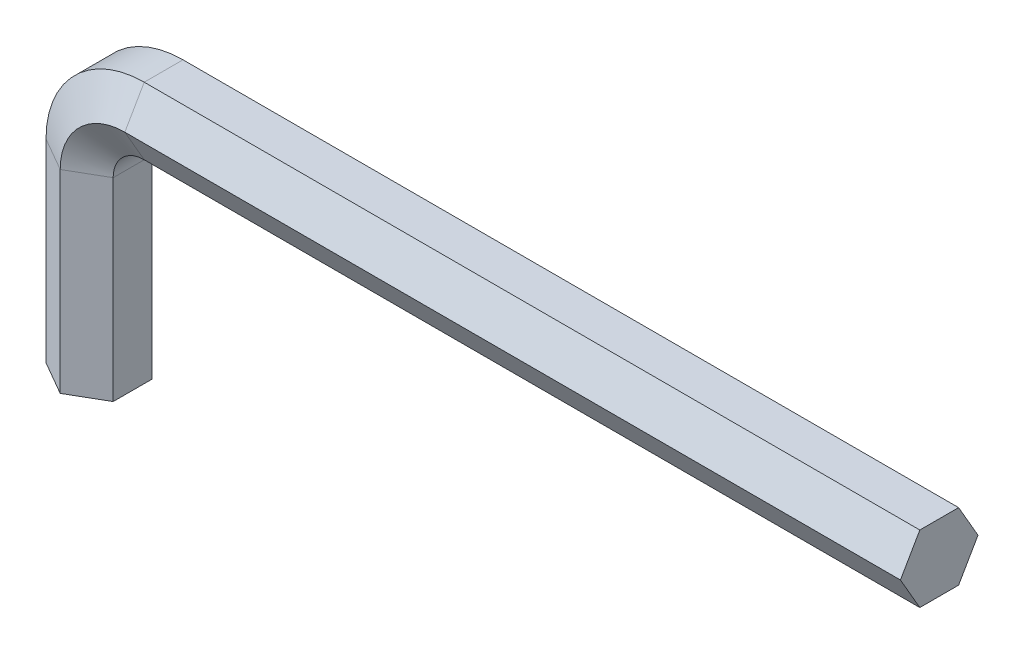
ISO-10303-21;
HEADER;
FILE_DESCRIPTION(('STEP AP214'),'2;1');
FILE_NAME('part.step','',(''),(''),'','','');
FILE_SCHEMA(('AUTOMOTIVE_DESIGN { 1 0 10303 214 1 1 1 1 }'));
ENDSEC;
DATA;
#1=APPLICATION_CONTEXT('core data for automotive mechanical design processes');
#2=APPLICATION_PROTOCOL_DEFINITION('international standard','automotive_design',2000,#1);
#3=PRODUCT_CONTEXT('',#1,'mechanical');
#4=PRODUCT('Part','Part','',(#3));
#5=PRODUCT_RELATED_PRODUCT_CATEGORY('part','',(#4));
#6=PRODUCT_DEFINITION_FORMATION('','',#4);
#7=PRODUCT_DEFINITION_CONTEXT('part definition',#1,'design');
#8=PRODUCT_DEFINITION('design','',#6,#7);
#9=PRODUCT_DEFINITION_SHAPE('','',#8);
#10=(LENGTH_UNIT() NAMED_UNIT(*) SI_UNIT(.MILLI.,.METRE.));
#11=(NAMED_UNIT(*) PLANE_ANGLE_UNIT() SI_UNIT($,.RADIAN.));
#12=(NAMED_UNIT(*) SI_UNIT($,.STERADIAN.) SOLID_ANGLE_UNIT());
#13=UNCERTAINTY_MEASURE_WITH_UNIT(LENGTH_MEASURE(1.E-05),#10,'distance_accuracy_value','');
#14=(GEOMETRIC_REPRESENTATION_CONTEXT(3) GLOBAL_UNCERTAINTY_ASSIGNED_CONTEXT((#13)) GLOBAL_UNIT_ASSIGNED_CONTEXT((#10,
#11,#12)) REPRESENTATION_CONTEXT('',''));
#15=CARTESIAN_POINT('',(0.,0.,0.));
#16=DIRECTION('',(0.,0.,1.));
#17=DIRECTION('',(1.,0.,0.));
#18=AXIS2_PLACEMENT_3D('',#15,#16,#17);
#19=CARTESIAN_POINT('',(62.3715948169983,0.,0.));
#20=DIRECTION('',(-1.,0.,0.));
#21=DIRECTION('',(0.,0.,1.));
#22=AXIS2_PLACEMENT_3D('',#19,#20,#21);
#23=PLANE('',#22);
#24=DIRECTION('',(0.,0.866025403784439,0.5));
#25=VECTOR('',#24,1.);
#26=CARTESIAN_POINT('',(62.3715948169983,-5.68289713359378,15.));
#27=LINE('',#26,#25);
#28=CARTESIAN_POINT('',(62.3715948169983,-5.68289713359378,15.));
#29=VERTEX_POINT('',#28);
#30=CARTESIAN_POINT('',(62.3715948169983,20.2978649799394,30.));
#31=VERTEX_POINT('',#30);
#32=EDGE_CURVE('E182',#29,#31,#27,.T.);
#33=ORIENTED_EDGE('',*,*,#32,.F.);
#34=DIRECTION('',(0.,0.,1.));
#35=VECTOR('',#34,1.);
#36=CARTESIAN_POINT('',(62.3715948169983,-5.68289713359378,-15.));
#37=LINE('',#36,#35);
#38=CARTESIAN_POINT('',(62.3715948169983,-5.68289713359378,-15.));
#39=VERTEX_POINT('',#38);
#40=EDGE_CURVE('E224',#39,#29,#37,.T.);
#41=ORIENTED_EDGE('',*,*,#40,.F.);
#42=DIRECTION('',(0.,-0.866025403784439,0.5));
#43=VECTOR('',#42,1.);
#44=CARTESIAN_POINT('',(62.3715948169983,20.2978649799394,-30.));
#45=LINE('',#44,#43);
#46=CARTESIAN_POINT('',(62.3715948169983,20.2978649799394,-30.));
#47=VERTEX_POINT('',#46);
#48=EDGE_CURVE('E211',#47,#39,#45,.T.);
#49=ORIENTED_EDGE('',*,*,#48,.F.);
#50=DIRECTION('',(0.,-0.866025403784439,-0.5));
#51=VECTOR('',#50,1.);
#52=CARTESIAN_POINT('',(62.3715948169983,46.2786270934726,-15.));
#53=LINE('',#52,#51);
#54=CARTESIAN_POINT('',(62.3715948169983,46.2786270934726,-15.));
#55=VERTEX_POINT('',#54);
#56=EDGE_CURVE('E134',#55,#47,#53,.T.);
#57=ORIENTED_EDGE('',*,*,#56,.F.);
#58=DIRECTION('',(0.,0.,-1.));
#59=VECTOR('',#58,1.);
#60=CARTESIAN_POINT('',(62.3715948169983,46.2786270934726,15.));
#61=LINE('',#60,#59);
#62=CARTESIAN_POINT('',(62.3715948169983,46.2786270934726,15.));
#63=VERTEX_POINT('',#62);
#64=EDGE_CURVE('E138',#63,#55,#61,.T.);
#65=ORIENTED_EDGE('',*,*,#64,.F.);
#66=DIRECTION('',(0.,0.866025403784439,-0.5));
#67=VECTOR('',#66,1.);
#68=CARTESIAN_POINT('',(62.3715948169983,20.2978649799394,30.));
#69=LINE('',#68,#67);
#70=EDGE_CURVE('E143',#31,#63,#69,.T.);
#71=ORIENTED_EDGE('',*,*,#70,.F.);
#72=EDGE_LOOP('',(#33,#41,#49,#57,#65,#71));
#73=FACE_BOUND('',#72,.T.);
#74=ADVANCED_FACE('F33',(#73),#23,.F.);
#75=CARTESIAN_POINT('',(-567.330540203062,-179.702135020061,0.));
#76=DIRECTION('',(0.,-1.,0.));
#77=DIRECTION('',(0.,0.,1.));
#78=AXIS2_PLACEMENT_3D('',#75,#76,#77);
#79=PLANE('',#78);
#80=DIRECTION('',(-0.866025403784439,0.,0.5));
#81=VECTOR('',#80,1.);
#82=CARTESIAN_POINT('',(-561.647643069469,-179.702135020061,15.));
#83=LINE('',#82,#81);
#84=CARTESIAN_POINT('',(-561.647643069469,-179.702135020061,15.));
#85=VERTEX_POINT('',#84);
#86=CARTESIAN_POINT('',(-587.628405183002,-179.702135020061,30.));
#87=VERTEX_POINT('',#86);
#88=EDGE_CURVE('E154',#85,#87,#83,.T.);
#89=ORIENTED_EDGE('',*,*,#88,.T.);
#90=DIRECTION('',(-0.866025403784439,0.,-0.5));
#91=VECTOR('',#90,1.);
#92=CARTESIAN_POINT('',(-587.628405183002,-179.702135020061,30.));
#93=LINE('',#92,#91);
#94=CARTESIAN_POINT('',(-613.609167296535,-179.702135020061,15.));
#95=VERTEX_POINT('',#94);
#96=EDGE_CURVE('E157',#87,#95,#93,.T.);
#97=ORIENTED_EDGE('',*,*,#96,.T.);
#98=DIRECTION('',(0.,0.,-1.));
#99=VECTOR('',#98,1.);
#100=CARTESIAN_POINT('',(-613.609167296535,-179.702135020061,15.));
#101=LINE('',#100,#99);
#102=CARTESIAN_POINT('',(-613.609167296535,-179.702135020061,-15.));
#103=VERTEX_POINT('',#102);
#104=EDGE_CURVE('E197',#95,#103,#101,.T.);
#105=ORIENTED_EDGE('',*,*,#104,.T.);
#106=DIRECTION('',(0.866025403784439,0.,-0.5));
#107=VECTOR('',#106,1.);
#108=CARTESIAN_POINT('',(-613.609167296535,-179.702135020061,-15.));
#109=LINE('',#108,#107);
#110=CARTESIAN_POINT('',(-587.628405183002,-179.702135020061,-30.));
#111=VERTEX_POINT('',#110);
#112=EDGE_CURVE('E52',#103,#111,#109,.T.);
#113=ORIENTED_EDGE('',*,*,#112,.T.);
#114=DIRECTION('',(0.866025403784439,0.,0.5));
#115=VECTOR('',#114,1.);
#116=CARTESIAN_POINT('',(-587.628405183002,-179.702135020061,-30.));
#117=LINE('',#116,#115);
#118=CARTESIAN_POINT('',(-561.647643069469,-179.702135020061,-15.));
#119=VERTEX_POINT('',#118);
#120=EDGE_CURVE('E46',#111,#119,#117,.T.);
#121=ORIENTED_EDGE('',*,*,#120,.T.);
#122=DIRECTION('',(0.,0.,1.));
#123=VECTOR('',#122,1.);
#124=CARTESIAN_POINT('',(-561.647643069469,-179.702135020061,-15.));
#125=LINE('',#124,#123);
#126=EDGE_CURVE('E11',#119,#85,#125,.T.);
#127=ORIENTED_EDGE('',*,*,#126,.T.);
#128=EDGE_LOOP('',(#89,#97,#105,#113,#121,#127));
#129=FACE_BOUND('',#128,.T.);
#130=ADVANCED_FACE('F156',(#129),#79,.T.);
#131=CARTESIAN_POINT('',(62.3715948169983,-5.68289713359378,15.));
#132=DIRECTION('',(0.,-0.5,0.866025403784439));
#133=DIRECTION('',(0.,-0.866025403784439,-0.5));
#134=AXIS2_PLACEMENT_3D('',#131,#132,#133);
#135=PLANE('',#134);
#136=DIRECTION('',(-1.,0.,0.));
#137=VECTOR('',#136,1.);
#138=CARTESIAN_POINT('',(62.3715948169983,20.2978649799394,30.));
#139=LINE('',#138,#137);
#140=CARTESIAN_POINT('',(-537.628405183002,20.2978649799394,30.));
#141=VERTEX_POINT('',#140);
#142=EDGE_CURVE('E187',#31,#141,#139,.T.);
#143=ORIENTED_EDGE('',*,*,#142,.T.);
#144=DIRECTION('',(0.,0.866025403784439,0.5));
#145=VECTOR('',#144,1.);
#146=CARTESIAN_POINT('',(-537.628405183002,-5.68289713359378,15.));
#147=LINE('',#146,#145);
#148=CARTESIAN_POINT('',(-537.628405183002,-5.68289713359378,15.));
#149=VERTEX_POINT('',#148);
#150=EDGE_CURVE('E256',#149,#141,#147,.T.);
#151=ORIENTED_EDGE('',*,*,#150,.F.);
#152=DIRECTION('',(-1.,0.,0.));
#153=VECTOR('',#152,1.);
#154=CARTESIAN_POINT('',(62.3715948169983,-5.68289713359378,15.));
#155=LINE('',#154,#153);
#156=EDGE_CURVE('E238',#29,#149,#155,.T.);
#157=ORIENTED_EDGE('',*,*,#156,.F.);
#158=ORIENTED_EDGE('',*,*,#32,.T.);
#159=EDGE_LOOP('',(#143,#151,#157,#158));
#160=FACE_BOUND('',#159,.T.);
#161=ADVANCED_FACE('F263',(#160),#135,.T.);
#162=CARTESIAN_POINT('',(62.3715948169983,20.2978649799394,30.));
#163=DIRECTION('',(0.,0.5,0.866025403784439));
#164=DIRECTION('',(0.,-0.866025403784439,0.5));
#165=AXIS2_PLACEMENT_3D('',#162,#163,#164);
#166=PLANE('',#165);
#167=DIRECTION('',(-1.,0.,0.));
#168=VECTOR('',#167,1.);
#169=CARTESIAN_POINT('',(62.3715948169983,46.2786270934726,15.));
#170=LINE('',#169,#168);
#171=CARTESIAN_POINT('',(-537.628405183002,46.2786270934726,15.));
#172=VERTEX_POINT('',#171);
#173=EDGE_CURVE('E186',#63,#172,#170,.T.);
#174=ORIENTED_EDGE('',*,*,#173,.T.);
#175=DIRECTION('',(0.,0.866025403784439,-0.5));
#176=VECTOR('',#175,1.);
#177=CARTESIAN_POINT('',(-537.628405183002,20.2978649799394,30.));
#178=LINE('',#177,#176);
#179=EDGE_CURVE('E183',#141,#172,#178,.T.);
#180=ORIENTED_EDGE('',*,*,#179,.F.);
#181=ORIENTED_EDGE('',*,*,#142,.F.);
#182=ORIENTED_EDGE('',*,*,#70,.T.);
#183=EDGE_LOOP('',(#174,#180,#181,#182));
#184=FACE_BOUND('',#183,.T.);
#185=ADVANCED_FACE('F266',(#184),#166,.T.);
#186=CARTESIAN_POINT('',(62.3715948169983,46.2786270934726,15.));
#187=DIRECTION('',(0.,1.,0.));
#188=DIRECTION('',(0.,0.,1.));
#189=AXIS2_PLACEMENT_3D('',#186,#187,#188);
#190=PLANE('',#189);
#191=DIRECTION('',(-1.,0.,0.));
#192=VECTOR('',#191,1.);
#193=CARTESIAN_POINT('',(62.3715948169983,46.2786270934726,-15.));
#194=LINE('',#193,#192);
#195=CARTESIAN_POINT('',(-537.628405183002,46.2786270934726,-15.));
#196=VERTEX_POINT('',#195);
#197=EDGE_CURVE('E200',#55,#196,#194,.T.);
#198=ORIENTED_EDGE('',*,*,#197,.T.);
#199=DIRECTION('',(0.,0.,-1.));
#200=VECTOR('',#199,1.);
#201=CARTESIAN_POINT('',(-537.628405183002,46.2786270934726,15.));
#202=LINE('',#201,#200);
#203=EDGE_CURVE('E190',#172,#196,#202,.T.);
#204=ORIENTED_EDGE('',*,*,#203,.F.);
#205=ORIENTED_EDGE('',*,*,#173,.F.);
#206=ORIENTED_EDGE('',*,*,#64,.T.);
#207=EDGE_LOOP('',(#198,#204,#205,#206));
#208=FACE_BOUND('',#207,.T.);
#209=ADVANCED_FACE('F320',(#208),#190,.T.);
#210=CARTESIAN_POINT('',(62.3715948169983,46.2786270934726,-15.));
#211=DIRECTION('',(0.,0.5,-0.866025403784439));
#212=DIRECTION('',(0.,0.866025403784439,0.5));
#213=AXIS2_PLACEMENT_3D('',#210,#211,#212);
#214=PLANE('',#213);
#215=DIRECTION('',(-1.,0.,0.));
#216=VECTOR('',#215,1.);
#217=CARTESIAN_POINT('',(62.3715948169983,20.2978649799394,-30.));
#218=LINE('',#217,#216);
#219=CARTESIAN_POINT('',(-537.628405183002,20.2978649799394,-30.));
#220=VERTEX_POINT('',#219);
#221=EDGE_CURVE('E213',#47,#220,#218,.T.);
#222=ORIENTED_EDGE('',*,*,#221,.T.);
#223=DIRECTION('',(0.,-0.866025403784439,-0.5));
#224=VECTOR('',#223,1.);
#225=CARTESIAN_POINT('',(-537.628405183002,46.2786270934726,-15.));
#226=LINE('',#225,#224);
#227=EDGE_CURVE('E203',#196,#220,#226,.T.);
#228=ORIENTED_EDGE('',*,*,#227,.F.);
#229=ORIENTED_EDGE('',*,*,#197,.F.);
#230=ORIENTED_EDGE('',*,*,#56,.T.);
#231=EDGE_LOOP('',(#222,#228,#229,#230));
#232=FACE_BOUND('',#231,.T.);
#233=ADVANCED_FACE('F328',(#232),#214,.T.);
#234=CARTESIAN_POINT('',(62.3715948169983,20.2978649799394,-30.));
#235=DIRECTION('',(0.,-0.5,-0.866025403784439));
#236=DIRECTION('',(0.,0.866025403784439,-0.5));
#237=AXIS2_PLACEMENT_3D('',#234,#235,#236);
#238=PLANE('',#237);
#239=DIRECTION('',(-1.,0.,0.));
#240=VECTOR('',#239,1.);
#241=CARTESIAN_POINT('',(62.3715948169983,-5.68289713359378,-15.));
#242=LINE('',#241,#240);
#243=CARTESIAN_POINT('',(-537.628405183002,-5.68289713359378,-15.));
#244=VERTEX_POINT('',#243);
#245=EDGE_CURVE('E226',#39,#244,#242,.T.);
#246=ORIENTED_EDGE('',*,*,#245,.T.);
#247=DIRECTION('',(0.,-0.866025403784439,0.5));
#248=VECTOR('',#247,1.);
#249=CARTESIAN_POINT('',(-537.628405183002,20.2978649799394,-30.));
#250=LINE('',#249,#248);
#251=EDGE_CURVE('E216',#220,#244,#250,.T.);
#252=ORIENTED_EDGE('',*,*,#251,.F.);
#253=ORIENTED_EDGE('',*,*,#221,.F.);
#254=ORIENTED_EDGE('',*,*,#48,.T.);
#255=EDGE_LOOP('',(#246,#252,#253,#254));
#256=FACE_BOUND('',#255,.T.);
#257=ADVANCED_FACE('F338',(#256),#238,.T.);
#258=CARTESIAN_POINT('',(62.3715948169983,-5.68289713359378,-15.));
#259=DIRECTION('',(0.,-1.,0.));
#260=DIRECTION('',(0.,0.,-1.));
#261=AXIS2_PLACEMENT_3D('',#258,#259,#260);
#262=PLANE('',#261);
#263=DIRECTION('',(0.,0.,1.));
#264=VECTOR('',#263,1.);
#265=CARTESIAN_POINT('',(-537.628405183002,-5.68289713359378,-15.));
#266=LINE('',#265,#264);
#267=EDGE_CURVE('E229',#244,#149,#266,.T.);
#268=ORIENTED_EDGE('',*,*,#267,.F.);
#269=ORIENTED_EDGE('',*,*,#245,.F.);
#270=ORIENTED_EDGE('',*,*,#40,.T.);
#271=ORIENTED_EDGE('',*,*,#156,.T.);
#272=EDGE_LOOP('',(#268,#269,#270,#271));
#273=FACE_BOUND('',#272,.T.);
#274=ADVANCED_FACE('F279',(#273),#262,.T.);
#275=CARTESIAN_POINT('',(-537.628405183002,-29.7021350200607,15.));
#276=DIRECTION('',(0.,0.,1.));
#277=DIRECTION('',(1.,0.,0.));
#278=AXIS2_PLACEMENT_3D('',#275,#276,#277);
#279=CONICAL_SURFACE('',#278,24.0192378864669,1.0471975511966);
#280=CARTESIAN_POINT('',(-537.628405183002,-29.7021350200607,30.));
#281=DIRECTION('',(0.,0.,1.));
#282=DIRECTION('',(0.,1.,0.));
#283=AXIS2_PLACEMENT_3D('',#280,#281,#282);
#284=CIRCLE('',#283,50.);
#285=CARTESIAN_POINT('',(-587.628405183002,-29.7021350200607,30.));
#286=VERTEX_POINT('',#285);
#287=EDGE_CURVE('E193',#141,#286,#284,.T.);
#288=ORIENTED_EDGE('',*,*,#287,.T.);
#289=DIRECTION('',(-0.866025403784439,0.,0.5));
#290=VECTOR('',#289,1.);
#291=CARTESIAN_POINT('',(-561.647643069469,-29.7021350200607,15.));
#292=LINE('',#291,#290);
#293=CARTESIAN_POINT('',(-561.647643069469,-29.7021350200607,15.));
#294=VERTEX_POINT('',#293);
#295=EDGE_CURVE('E175',#294,#286,#292,.T.);
#296=ORIENTED_EDGE('',*,*,#295,.F.);
#297=CARTESIAN_POINT('',(-537.628405183002,-29.7021350200607,15.));
#298=DIRECTION('',(0.,0.,1.));
#299=DIRECTION('',(0.,1.,0.));
#300=AXIS2_PLACEMENT_3D('',#297,#298,#299);
#301=CIRCLE('',#300,24.0192378864669);
#302=EDGE_CURVE('E240',#149,#294,#301,.T.);
#303=ORIENTED_EDGE('',*,*,#302,.F.);
#304=ORIENTED_EDGE('',*,*,#150,.T.);
#305=EDGE_LOOP('',(#288,#296,#303,#304));
#306=FACE_BOUND('',#305,.T.);
#307=ADVANCED_FACE('F246',(#306),#279,.F.);
#308=CARTESIAN_POINT('',(-537.628405183002,-29.7021350200607,30.));
#309=DIRECTION('',(0.,0.,-1.));
#310=DIRECTION('',(-1.,0.,0.));
#311=AXIS2_PLACEMENT_3D('',#308,#309,#310);
#312=CONICAL_SURFACE('',#311,50.,1.0471975511966);
#313=CARTESIAN_POINT('',(-537.628405183002,-29.7021350200607,15.));
#314=DIRECTION('',(0.,0.,1.));
#315=DIRECTION('',(0.,1.,0.));
#316=AXIS2_PLACEMENT_3D('',#313,#314,#315);
#317=CIRCLE('',#316,75.9807621135332);
#318=CARTESIAN_POINT('',(-613.609167296535,-29.7021350200607,15.));
#319=VERTEX_POINT('',#318);
#320=EDGE_CURVE('E121',#172,#319,#317,.T.);
#321=ORIENTED_EDGE('',*,*,#320,.T.);
#322=DIRECTION('',(-0.866025403784439,0.,-0.5));
#323=VECTOR('',#322,1.);
#324=CARTESIAN_POINT('',(-587.628405183002,-29.7021350200607,30.));
#325=LINE('',#324,#323);
#326=EDGE_CURVE('E191',#286,#319,#325,.T.);
#327=ORIENTED_EDGE('',*,*,#326,.F.);
#328=ORIENTED_EDGE('',*,*,#287,.F.);
#329=ORIENTED_EDGE('',*,*,#179,.T.);
#330=EDGE_LOOP('',(#321,#327,#328,#329));
#331=FACE_BOUND('',#330,.T.);
#332=ADVANCED_FACE('F269',(#331),#312,.T.);
#333=CARTESIAN_POINT('',(-537.628405183002,-29.7021350200607,0.));
#334=DIRECTION('',(0.,0.,1.));
#335=DIRECTION('',(1.,0.,0.));
#336=AXIS2_PLACEMENT_3D('',#333,#334,#335);
#337=CYLINDRICAL_SURFACE('',#336,75.9807621135332);
#338=CARTESIAN_POINT('',(-537.628405183002,-29.7021350200607,-15.));
#339=DIRECTION('',(0.,0.,1.));
#340=DIRECTION('',(0.,1.,0.));
#341=AXIS2_PLACEMENT_3D('',#338,#339,#340);
#342=CIRCLE('',#341,75.9807621135332);
#343=CARTESIAN_POINT('',(-613.609167296535,-29.7021350200607,-15.));
#344=VERTEX_POINT('',#343);
#345=EDGE_CURVE('E112',#196,#344,#342,.T.);
#346=ORIENTED_EDGE('',*,*,#345,.T.);
#347=DIRECTION('',(0.,0.,-1.));
#348=VECTOR('',#347,1.);
#349=CARTESIAN_POINT('',(-613.609167296535,-29.7021350200607,15.));
#350=LINE('',#349,#348);
#351=EDGE_CURVE('E194',#319,#344,#350,.T.);
#352=ORIENTED_EDGE('',*,*,#351,.F.);
#353=ORIENTED_EDGE('',*,*,#320,.F.);
#354=ORIENTED_EDGE('',*,*,#203,.T.);
#355=EDGE_LOOP('',(#346,#352,#353,#354));
#356=FACE_BOUND('',#355,.T.);
#357=ADVANCED_FACE('F271',(#356),#337,.T.);
#358=CARTESIAN_POINT('',(-537.628405183002,-29.7021350200607,-15.));
#359=DIRECTION('',(0.,0.,1.));
#360=DIRECTION('',(1.,0.,0.));
#361=AXIS2_PLACEMENT_3D('',#358,#359,#360);
#362=CONICAL_SURFACE('',#361,75.9807621135332,1.0471975511966);
#363=CARTESIAN_POINT('',(-537.628405183002,-29.7021350200607,-30.));
#364=DIRECTION('',(0.,0.,1.));
#365=DIRECTION('',(0.,1.,0.));
#366=AXIS2_PLACEMENT_3D('',#363,#364,#365);
#367=CIRCLE('',#366,50.);
#368=CARTESIAN_POINT('',(-587.628405183002,-29.7021350200607,-30.));
#369=VERTEX_POINT('',#368);
#370=EDGE_CURVE('E105',#220,#369,#367,.T.);
#371=ORIENTED_EDGE('',*,*,#370,.T.);
#372=DIRECTION('',(0.866025403784439,0.,-0.5));
#373=VECTOR('',#372,1.);
#374=CARTESIAN_POINT('',(-613.609167296535,-29.7021350200607,-15.));
#375=LINE('',#374,#373);
#376=EDGE_CURVE('E207',#344,#369,#375,.T.);
#377=ORIENTED_EDGE('',*,*,#376,.F.);
#378=ORIENTED_EDGE('',*,*,#345,.F.);
#379=ORIENTED_EDGE('',*,*,#227,.T.);
#380=EDGE_LOOP('',(#371,#377,#378,#379));
#381=FACE_BOUND('',#380,.T.);
#382=ADVANCED_FACE('F277',(#381),#362,.T.);
#383=CARTESIAN_POINT('',(-537.628405183002,-29.7021350200607,-30.));
#384=DIRECTION('',(0.,0.,-1.));
#385=DIRECTION('',(-1.,0.,0.));
#386=AXIS2_PLACEMENT_3D('',#383,#384,#385);
#387=CONICAL_SURFACE('',#386,50.,1.0471975511966);
#388=CARTESIAN_POINT('',(-537.628405183002,-29.7021350200607,-15.));
#389=DIRECTION('',(0.,0.,1.));
#390=DIRECTION('',(0.,1.,0.));
#391=AXIS2_PLACEMENT_3D('',#388,#389,#390);
#392=CIRCLE('',#391,24.0192378864669);
#393=CARTESIAN_POINT('',(-561.647643069469,-29.7021350200607,-15.));
#394=VERTEX_POINT('',#393);
#395=EDGE_CURVE('E231',#244,#394,#392,.T.);
#396=ORIENTED_EDGE('',*,*,#395,.T.);
#397=DIRECTION('',(0.866025403784439,0.,0.5));
#398=VECTOR('',#397,1.);
#399=CARTESIAN_POINT('',(-587.628405183002,-29.7021350200607,-30.));
#400=LINE('',#399,#398);
#401=EDGE_CURVE('E219',#369,#394,#400,.T.);
#402=ORIENTED_EDGE('',*,*,#401,.F.);
#403=ORIENTED_EDGE('',*,*,#370,.F.);
#404=ORIENTED_EDGE('',*,*,#251,.T.);
#405=EDGE_LOOP('',(#396,#402,#403,#404));
#406=FACE_BOUND('',#405,.T.);
#407=ADVANCED_FACE('F381',(#406),#387,.F.);
#408=CARTESIAN_POINT('',(-537.628405183002,-29.7021350200607,0.));
#409=DIRECTION('',(0.,0.,1.));
#410=DIRECTION('',(1.,0.,0.));
#411=AXIS2_PLACEMENT_3D('',#408,#409,#410);
#412=CYLINDRICAL_SURFACE('',#411,24.0192378864669);
#413=DIRECTION('',(0.,0.,1.));
#414=VECTOR('',#413,1.);
#415=CARTESIAN_POINT('',(-561.647643069469,-29.7021350200607,-15.));
#416=LINE('',#415,#414);
#417=EDGE_CURVE('E180',#394,#294,#416,.T.);
#418=ORIENTED_EDGE('',*,*,#417,.F.);
#419=ORIENTED_EDGE('',*,*,#395,.F.);
#420=ORIENTED_EDGE('',*,*,#267,.T.);
#421=ORIENTED_EDGE('',*,*,#302,.T.);
#422=EDGE_LOOP('',(#418,#419,#420,#421));
#423=FACE_BOUND('',#422,.T.);
#424=ADVANCED_FACE('F249',(#423),#412,.F.);
#425=CARTESIAN_POINT('',(-561.647643069469,-29.7021350200607,15.));
#426=DIRECTION('',(0.5,0.,0.866025403784439));
#427=DIRECTION('',(0.866025403784439,0.,-0.5));
#428=AXIS2_PLACEMENT_3D('',#425,#426,#427);
#429=PLANE('',#428);
#430=DIRECTION('',(0.,-1.,0.));
#431=VECTOR('',#430,1.);
#432=CARTESIAN_POINT('',(-587.628405183002,-29.7021350200607,30.));
#433=LINE('',#432,#431);
#434=EDGE_CURVE('E162',#286,#87,#433,.T.);
#435=ORIENTED_EDGE('',*,*,#434,.T.);
#436=ORIENTED_EDGE('',*,*,#88,.F.);
#437=DIRECTION('',(0.,-1.,0.));
#438=VECTOR('',#437,1.);
#439=CARTESIAN_POINT('',(-561.647643069469,-29.7021350200607,15.));
#440=LINE('',#439,#438);
#441=EDGE_CURVE('E163',#294,#85,#440,.T.);
#442=ORIENTED_EDGE('',*,*,#441,.F.);
#443=ORIENTED_EDGE('',*,*,#295,.T.);
#444=EDGE_LOOP('',(#435,#436,#442,#443));
#445=FACE_BOUND('',#444,.T.);
#446=ADVANCED_FACE('F173',(#445),#429,.T.);
#447=CARTESIAN_POINT('',(-587.628405183002,-29.7021350200607,30.));
#448=DIRECTION('',(-0.5,0.,0.866025403784439));
#449=DIRECTION('',(0.866025403784439,0.,0.5));
#450=AXIS2_PLACEMENT_3D('',#447,#448,#449);
#451=PLANE('',#450);
#452=DIRECTION('',(0.,-1.,0.));
#453=VECTOR('',#452,1.);
#454=CARTESIAN_POINT('',(-613.609167296535,-29.7021350200607,15.));
#455=LINE('',#454,#453);
#456=EDGE_CURVE('E170',#319,#95,#455,.T.);
#457=ORIENTED_EDGE('',*,*,#456,.T.);
#458=ORIENTED_EDGE('',*,*,#96,.F.);
#459=ORIENTED_EDGE('',*,*,#434,.F.);
#460=ORIENTED_EDGE('',*,*,#326,.T.);
#461=EDGE_LOOP('',(#457,#458,#459,#460));
#462=FACE_BOUND('',#461,.T.);
#463=ADVANCED_FACE('F167',(#462),#451,.T.);
#464=CARTESIAN_POINT('',(-613.609167296535,-29.7021350200607,15.));
#465=DIRECTION('',(-1.,0.,0.));
#466=DIRECTION('',(0.,0.,1.));
#467=AXIS2_PLACEMENT_3D('',#464,#465,#466);
#468=PLANE('',#467);
#469=DIRECTION('',(0.,-1.,0.));
#470=VECTOR('',#469,1.);
#471=CARTESIAN_POINT('',(-613.609167296535,-29.7021350200607,-15.));
#472=LINE('',#471,#470);
#473=EDGE_CURVE('E90',#344,#103,#472,.T.);
#474=ORIENTED_EDGE('',*,*,#473,.T.);
#475=ORIENTED_EDGE('',*,*,#104,.F.);
#476=ORIENTED_EDGE('',*,*,#456,.F.);
#477=ORIENTED_EDGE('',*,*,#351,.T.);
#478=EDGE_LOOP('',(#474,#475,#476,#477));
#479=FACE_BOUND('',#478,.T.);
#480=ADVANCED_FACE('F413',(#479),#468,.T.);
#481=CARTESIAN_POINT('',(-613.609167296535,-29.7021350200607,-15.));
#482=DIRECTION('',(-0.5,0.,-0.866025403784439));
#483=DIRECTION('',(-0.866025403784439,0.,0.5));
#484=AXIS2_PLACEMENT_3D('',#481,#482,#483);
#485=PLANE('',#484);
#486=DIRECTION('',(0.,-1.,0.));
#487=VECTOR('',#486,1.);
#488=CARTESIAN_POINT('',(-587.628405183002,-29.7021350200607,-30.));
#489=LINE('',#488,#487);
#490=EDGE_CURVE('E82',#369,#111,#489,.T.);
#491=ORIENTED_EDGE('',*,*,#490,.T.);
#492=ORIENTED_EDGE('',*,*,#112,.F.);
#493=ORIENTED_EDGE('',*,*,#473,.F.);
#494=ORIENTED_EDGE('',*,*,#376,.T.);
#495=EDGE_LOOP('',(#491,#492,#493,#494));
#496=FACE_BOUND('',#495,.T.);
#497=ADVANCED_FACE('F289',(#496),#485,.T.);
#498=CARTESIAN_POINT('',(-587.628405183002,-29.7021350200607,-30.));
#499=DIRECTION('',(0.5,0.,-0.866025403784439));
#500=DIRECTION('',(-0.866025403784439,0.,-0.5));
#501=AXIS2_PLACEMENT_3D('',#498,#499,#500);
#502=PLANE('',#501);
#503=DIRECTION('',(0.,-1.,0.));
#504=VECTOR('',#503,1.);
#505=CARTESIAN_POINT('',(-561.647643069469,-29.7021350200607,-15.));
#506=LINE('',#505,#504);
#507=EDGE_CURVE('E40',#394,#119,#506,.T.);
#508=ORIENTED_EDGE('',*,*,#507,.T.);
#509=ORIENTED_EDGE('',*,*,#120,.F.);
#510=ORIENTED_EDGE('',*,*,#490,.F.);
#511=ORIENTED_EDGE('',*,*,#401,.T.);
#512=EDGE_LOOP('',(#508,#509,#510,#511));
#513=FACE_BOUND('',#512,.T.);
#514=ADVANCED_FACE('F284',(#513),#502,.T.);
#515=CARTESIAN_POINT('',(-561.647643069469,-29.7021350200607,-15.));
#516=DIRECTION('',(1.,0.,0.));
#517=DIRECTION('',(0.,0.,-1.));
#518=AXIS2_PLACEMENT_3D('',#515,#516,#517);
#519=PLANE('',#518);
#520=ORIENTED_EDGE('',*,*,#126,.F.);
#521=ORIENTED_EDGE('',*,*,#507,.F.);
#522=ORIENTED_EDGE('',*,*,#417,.T.);
#523=ORIENTED_EDGE('',*,*,#441,.T.);
#524=EDGE_LOOP('',(#520,#521,#522,#523));
#525=FACE_BOUND('',#524,.T.);
#526=ADVANCED_FACE('F241',(#525),#519,.T.);
#527=CLOSED_SHELL('',(#74,#130,#161,#185,#209,#233,#257,#274,#307,#332,#357,#382,#407,#424,#446,
#463,#480,#497,#514,#526));
#528=MANIFOLD_SOLID_BREP('B2',#527);
#529=ADVANCED_BREP_SHAPE_REPRESENTATION('',(#18,#528),#14);
#530=SHAPE_DEFINITION_REPRESENTATION(#9,#529);
ENDSEC;
END-ISO-10303-21;
